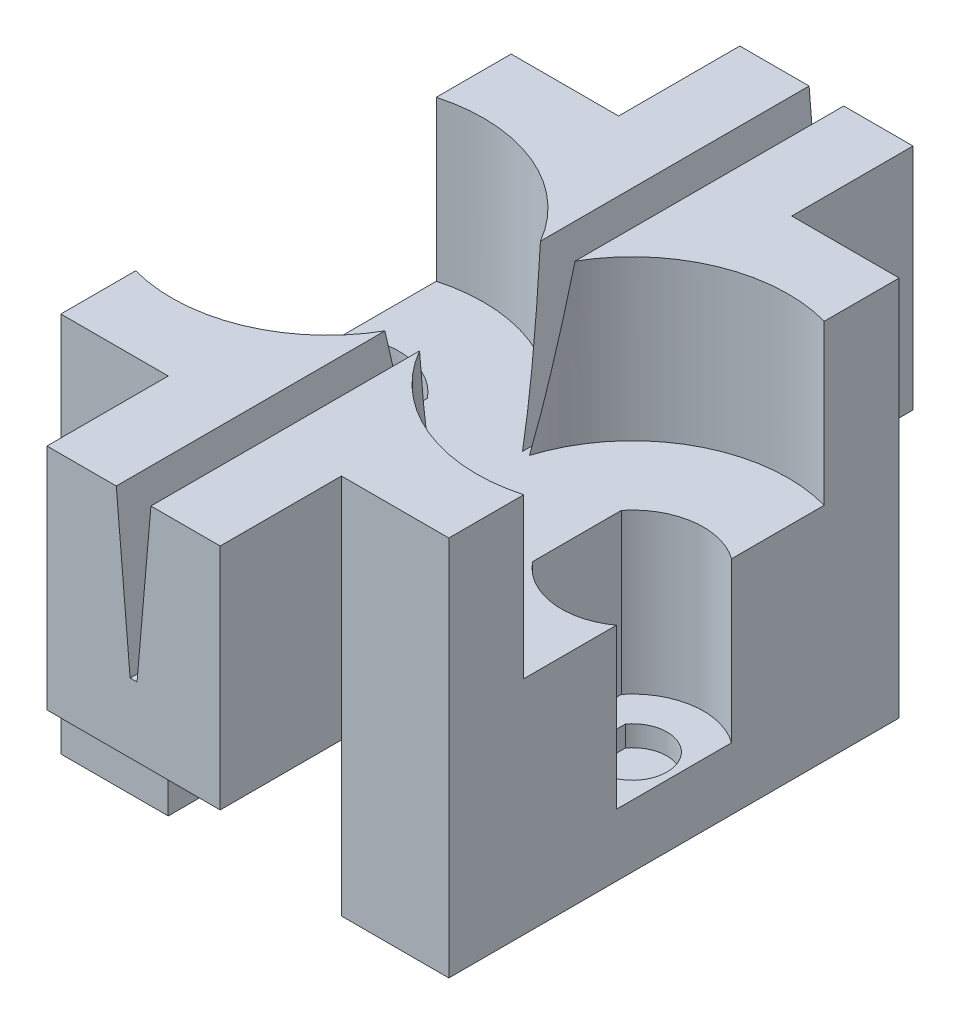
ISO-10303-21;
HEADER;
FILE_DESCRIPTION(('STEP AP214'),'2;1');
FILE_NAME('part.step','',(''),(''),'','','');
FILE_SCHEMA(('AUTOMOTIVE_DESIGN { 1 0 10303 214 1 1 1 1 }'));
ENDSEC;
DATA;
#1=APPLICATION_CONTEXT('core data for automotive mechanical design processes');
#2=APPLICATION_PROTOCOL_DEFINITION('international standard','automotive_design',2000,#1);
#3=PRODUCT_CONTEXT('',#1,'mechanical');
#4=PRODUCT('Part','Part','',(#3));
#5=PRODUCT_RELATED_PRODUCT_CATEGORY('part','',(#4));
#6=PRODUCT_DEFINITION_FORMATION('','',#4);
#7=PRODUCT_DEFINITION_CONTEXT('part definition',#1,'design');
#8=PRODUCT_DEFINITION('design','',#6,#7);
#9=PRODUCT_DEFINITION_SHAPE('','',#8);
#10=(LENGTH_UNIT() NAMED_UNIT(*) SI_UNIT(.MILLI.,.METRE.));
#11=(NAMED_UNIT(*) PLANE_ANGLE_UNIT() SI_UNIT($,.RADIAN.));
#12=(NAMED_UNIT(*) SI_UNIT($,.STERADIAN.) SOLID_ANGLE_UNIT());
#13=UNCERTAINTY_MEASURE_WITH_UNIT(LENGTH_MEASURE(1.E-05),#10,'distance_accuracy_value','');
#14=(GEOMETRIC_REPRESENTATION_CONTEXT(3) GLOBAL_UNCERTAINTY_ASSIGNED_CONTEXT((#13)) GLOBAL_UNIT_ASSIGNED_CONTEXT((#10,
#11,#12)) REPRESENTATION_CONTEXT('',''));
#15=CARTESIAN_POINT('',(0.,0.,0.));
#16=DIRECTION('',(0.,0.,1.));
#17=DIRECTION('',(1.,0.,0.));
#18=AXIS2_PLACEMENT_3D('',#15,#16,#17);
#19=CARTESIAN_POINT('',(0.,0.,0.));
#20=DIRECTION('',(0.,-1.,0.));
#21=DIRECTION('',(0.,0.,-1.));
#22=AXIS2_PLACEMENT_3D('',#19,#20,#21);
#23=PLANE('',#22);
#24=DIRECTION('',(0.,0.,1.));
#25=VECTOR('',#24,1.);
#26=CARTESIAN_POINT('',(-12.5,0.,-50.));
#27=LINE('',#26,#25);
#28=CARTESIAN_POINT('',(-12.5,0.,-32.5));
#29=VERTEX_POINT('',#28);
#30=CARTESIAN_POINT('',(-12.5,0.,32.5));
#31=VERTEX_POINT('',#30);
#32=EDGE_CURVE('E300',#29,#31,#27,.T.);
#33=ORIENTED_EDGE('',*,*,#32,.T.);
#34=DIRECTION('',(-1.,0.,0.));
#35=VECTOR('',#34,1.);
#36=CARTESIAN_POINT('',(-28.,0.,32.5));
#37=LINE('',#36,#35);
#38=CARTESIAN_POINT('',(-28.,0.,32.5));
#39=VERTEX_POINT('',#38);
#40=EDGE_CURVE('E611',#31,#39,#37,.T.);
#41=ORIENTED_EDGE('',*,*,#40,.T.);
#42=DIRECTION('',(0.,0.,1.));
#43=VECTOR('',#42,1.);
#44=CARTESIAN_POINT('',(-28.,0.,50.));
#45=LINE('',#44,#43);
#46=CARTESIAN_POINT('',(-28.,0.,-32.5));
#47=VERTEX_POINT('',#46);
#48=EDGE_CURVE('E467',#47,#39,#45,.T.);
#49=ORIENTED_EDGE('',*,*,#48,.F.);
#50=DIRECTION('',(1.,0.,0.));
#51=VECTOR('',#50,1.);
#52=CARTESIAN_POINT('',(-28.,0.,-32.5));
#53=LINE('',#52,#51);
#54=EDGE_CURVE('E318',#47,#29,#53,.T.);
#55=ORIENTED_EDGE('',*,*,#54,.T.);
#56=EDGE_LOOP('',(#33,#41,#49,#55));
#57=FACE_BOUND('',#56,.T.);
#58=ADVANCED_FACE('F35',(#57),#23,.T.);
#59=CARTESIAN_POINT('',(-14.,9.,-6.40800280898814));
#60=DIRECTION('',(-1.,0.,0.));
#61=DIRECTION('',(0.,0.,1.));
#62=AXIS2_PLACEMENT_3D('',#59,#60,#61);
#63=PLANE('',#62);
#64=DIRECTION('',(0.,0.,-1.));
#65=VECTOR('',#64,1.);
#66=CARTESIAN_POINT('',(-14.,32.,-50.));
#67=LINE('',#66,#65);
#68=CARTESIAN_POINT('',(-14.,32.,6.40800280898814));
#69=VERTEX_POINT('',#68);
#70=CARTESIAN_POINT('',(-14.,32.,-6.40800280898814));
#71=VERTEX_POINT('',#70);
#72=EDGE_CURVE('E340',#69,#71,#67,.T.);
#73=ORIENTED_EDGE('',*,*,#72,.T.);
#74=DIRECTION('',(0.,1.,0.));
#75=VECTOR('',#74,1.);
#76=CARTESIAN_POINT('',(-14.,9.,-6.40800280898814));
#77=LINE('',#76,#75);
#78=CARTESIAN_POINT('',(-14.,9.,-6.40800280898814));
#79=VERTEX_POINT('',#78);
#80=EDGE_CURVE('E337',#79,#71,#77,.T.);
#81=ORIENTED_EDGE('',*,*,#80,.F.);
#82=DIRECTION('',(0.,0.,1.));
#83=VECTOR('',#82,1.);
#84=CARTESIAN_POINT('',(-14.,9.,-6.40800280898814));
#85=LINE('',#84,#83);
#86=CARTESIAN_POINT('',(-14.,9.,6.40800280898814));
#87=VERTEX_POINT('',#86);
#88=EDGE_CURVE('E334',#79,#87,#85,.T.);
#89=ORIENTED_EDGE('',*,*,#88,.T.);
#90=DIRECTION('',(0.,1.,0.));
#91=VECTOR('',#90,1.);
#92=CARTESIAN_POINT('',(-14.,9.,6.40800280898814));
#93=LINE('',#92,#91);
#94=EDGE_CURVE('E336',#87,#69,#93,.T.);
#95=ORIENTED_EDGE('',*,*,#94,.T.);
#96=EDGE_LOOP('',(#73,#81,#89,#95));
#97=FACE_BOUND('',#96,.T.);
#98=ADVANCED_FACE('F584',(#97),#63,.T.);
#99=CARTESIAN_POINT('',(-22.,9.,0.));
#100=DIRECTION('',(0.,-1.,0.));
#101=DIRECTION('',(0.,0.,-1.));
#102=AXIS2_PLACEMENT_3D('',#99,#100,#101);
#103=PLANE('',#102);
#104=CARTESIAN_POINT('',(-22.,9.,0.));
#105=DIRECTION('',(0.,-1.,0.));
#106=DIRECTION('',(0.,0.,-1.));
#107=AXIS2_PLACEMENT_3D('',#104,#105,#106);
#108=CIRCLE('',#107,10.25);
#109=CARTESIAN_POINT('',(-28.,9.,8.3103850692973));
#110=VERTEX_POINT('',#109);
#111=EDGE_CURVE('E331',#87,#110,#108,.T.);
#112=ORIENTED_EDGE('',*,*,#111,.F.);
#113=ORIENTED_EDGE('',*,*,#88,.F.);
#114=CARTESIAN_POINT('',(-28.,9.,-8.31038506929733));
#115=VERTEX_POINT('',#114);
#116=EDGE_CURVE('E329',#115,#79,#108,.T.);
#117=ORIENTED_EDGE('',*,*,#116,.F.);
#118=DIRECTION('',(0.,0.,-1.));
#119=VECTOR('',#118,1.);
#120=CARTESIAN_POINT('',(-28.,9.,50.));
#121=LINE('',#120,#119);
#122=EDGE_CURVE('E11',#110,#115,#121,.T.);
#123=ORIENTED_EDGE('',*,*,#122,.F.);
#124=EDGE_LOOP('',(#112,#113,#117,#123));
#125=FACE_BOUND('',#124,.T.);
#126=CARTESIAN_POINT('',(-22.,9.,0.));
#127=DIRECTION('',(0.,-1.,0.));
#128=DIRECTION('',(0.,0.,-1.));
#129=AXIS2_PLACEMENT_3D('',#126,#127,#128);
#130=CIRCLE('',#129,5.);
#131=CARTESIAN_POINT('',(-18.,9.,3.));
#132=VERTEX_POINT('',#131);
#133=CARTESIAN_POINT('',(-18.,9.,-3.));
#134=VERTEX_POINT('',#133);
#135=EDGE_CURVE('E58',#132,#134,#130,.T.);
#136=ORIENTED_EDGE('',*,*,#135,.T.);
#137=DIRECTION('',(0.,0.,1.));
#138=VECTOR('',#137,1.);
#139=CARTESIAN_POINT('',(-18.,9.,-3.));
#140=LINE('',#139,#138);
#141=EDGE_CURVE('E309',#134,#132,#140,.T.);
#142=ORIENTED_EDGE('',*,*,#141,.T.);
#143=EDGE_LOOP('',(#136,#142));
#144=FACE_BOUND('',#143,.T.);
#145=ADVANCED_FACE('F591',(#125,#144),#103,.F.);
#146=CARTESIAN_POINT('',(-28.,55.,50.));
#147=DIRECTION('',(1.,0.,0.));
#148=DIRECTION('',(0.,0.,-1.));
#149=AXIS2_PLACEMENT_3D('',#146,#147,#148);
#150=PLANE('',#149);
#151=ORIENTED_EDGE('',*,*,#48,.T.);
#152=DIRECTION('',(0.,1.,0.));
#153=VECTOR('',#152,1.);
#154=CARTESIAN_POINT('',(-28.,0.,32.5));
#155=LINE('',#154,#153);
#156=CARTESIAN_POINT('',(-28.,55.,32.5));
#157=VERTEX_POINT('',#156);
#158=EDGE_CURVE('E636',#39,#157,#155,.T.);
#159=ORIENTED_EDGE('',*,*,#158,.T.);
#160=DIRECTION('',(0.,0.,1.));
#161=VECTOR('',#160,1.);
#162=CARTESIAN_POINT('',(-28.,55.,50.));
#163=LINE('',#162,#161);
#164=CARTESIAN_POINT('',(-28.,55.,21.6852484422014));
#165=VERTEX_POINT('',#164);
#166=EDGE_CURVE('E458',#165,#157,#163,.T.);
#167=ORIENTED_EDGE('',*,*,#166,.F.);
#168=DIRECTION('',(0.,1.,0.));
#169=VECTOR('',#168,1.);
#170=CARTESIAN_POINT('',(-28.,32.,21.6852484422014));
#171=LINE('',#170,#169);
#172=CARTESIAN_POINT('',(-28.,32.,21.6852484422014));
#173=VERTEX_POINT('',#172);
#174=EDGE_CURVE('E356',#173,#165,#171,.T.);
#175=ORIENTED_EDGE('',*,*,#174,.F.);
#176=DIRECTION('',(0.,0.,1.));
#177=VECTOR('',#176,1.);
#178=CARTESIAN_POINT('',(-28.,32.,50.));
#179=LINE('',#178,#177);
#180=CARTESIAN_POINT('',(-28.,32.,8.3103850692973));
#181=VERTEX_POINT('',#180);
#182=EDGE_CURVE('E360',#181,#173,#179,.T.);
#183=ORIENTED_EDGE('',*,*,#182,.F.);
#184=DIRECTION('',(0.,1.,0.));
#185=VECTOR('',#184,1.);
#186=CARTESIAN_POINT('',(-28.,9.,8.3103850692973));
#187=LINE('',#186,#185);
#188=EDGE_CURVE('E344',#110,#181,#187,.T.);
#189=ORIENTED_EDGE('',*,*,#188,.F.);
#190=ORIENTED_EDGE('',*,*,#122,.T.);
#191=DIRECTION('',(0.,1.,0.));
#192=VECTOR('',#191,1.);
#193=CARTESIAN_POINT('',(-28.,9.,-8.31038506929733));
#194=LINE('',#193,#192);
#195=CARTESIAN_POINT('',(-28.,32.,-8.31038506929733));
#196=VERTEX_POINT('',#195);
#197=EDGE_CURVE('E346',#196,#115,#194,.F.);
#198=ORIENTED_EDGE('',*,*,#197,.F.);
#199=CARTESIAN_POINT('',(-28.,32.,-21.6852484422015));
#200=VERTEX_POINT('',#199);
#201=EDGE_CURVE('E362',#200,#196,#179,.T.);
#202=ORIENTED_EDGE('',*,*,#201,.F.);
#203=DIRECTION('',(0.,1.,0.));
#204=VECTOR('',#203,1.);
#205=CARTESIAN_POINT('',(-28.,32.,-21.6852484422015));
#206=LINE('',#205,#204);
#207=CARTESIAN_POINT('',(-28.,55.,-21.6852484422015));
#208=VERTEX_POINT('',#207);
#209=EDGE_CURVE('E358',#208,#200,#206,.F.);
#210=ORIENTED_EDGE('',*,*,#209,.F.);
#211=CARTESIAN_POINT('',(-28.,55.,-32.5));
#212=VERTEX_POINT('',#211);
#213=EDGE_CURVE('E459',#212,#208,#163,.T.);
#214=ORIENTED_EDGE('',*,*,#213,.F.);
#215=DIRECTION('',(0.,1.,0.));
#216=VECTOR('',#215,1.);
#217=CARTESIAN_POINT('',(-28.,0.,-32.5));
#218=LINE('',#217,#216);
#219=EDGE_CURVE('E316',#47,#212,#218,.T.);
#220=ORIENTED_EDGE('',*,*,#219,.F.);
#221=EDGE_LOOP('',(#151,#159,#167,#175,#183,#189,#190,#198,#202,#210,#214,#220));
#222=FACE_BOUND('',#221,.T.);
#223=ADVANCED_FACE('F580',(#222),#150,.F.);
#224=CARTESIAN_POINT('',(-0.5,32.,-50.));
#225=DIRECTION('',(0.,-1.,0.));
#226=DIRECTION('',(0.,0.,-1.));
#227=AXIS2_PLACEMENT_3D('',#224,#225,#226);
#228=PLANE('',#227);
#229=ORIENTED_EDGE('',*,*,#72,.F.);
#230=CARTESIAN_POINT('',(-22.,32.,0.));
#231=DIRECTION('',(0.,-1.,0.));
#232=DIRECTION('',(0.,0.,-1.));
#233=AXIS2_PLACEMENT_3D('',#230,#231,#232);
#234=CIRCLE('',#233,10.25);
#235=EDGE_CURVE('E43',#181,#69,#234,.F.);
#236=ORIENTED_EDGE('',*,*,#235,.F.);
#237=ORIENTED_EDGE('',*,*,#182,.T.);
#238=CARTESIAN_POINT('',(-22.,32.,0.));
#239=DIRECTION('',(0.,-1.,0.));
#240=DIRECTION('',(0.,0.,1.));
#241=AXIS2_PLACEMENT_3D('',#238,#239,#240);
#242=CIRCLE('',#241,22.5);
#243=CARTESIAN_POINT('',(-0.500000000000006,32.,6.63324958071084));
#244=VERTEX_POINT('',#243);
#245=EDGE_CURVE('E349',#244,#173,#242,.T.);
#246=ORIENTED_EDGE('',*,*,#245,.F.);
#247=DIRECTION('',(0.,0.,1.));
#248=VECTOR('',#247,1.);
#249=CARTESIAN_POINT('',(-0.5,32.,-50.));
#250=LINE('',#249,#248);
#251=CARTESIAN_POINT('',(-0.5,32.,50.));
#252=VERTEX_POINT('',#251);
#253=EDGE_CURVE('E440',#244,#252,#250,.T.);
#254=ORIENTED_EDGE('',*,*,#253,.T.);
#255=DIRECTION('',(1.,0.,0.));
#256=VECTOR('',#255,1.);
#257=CARTESIAN_POINT('',(-0.5,32.,50.));
#258=LINE('',#257,#256);
#259=CARTESIAN_POINT('',(0.5,32.,50.));
#260=VERTEX_POINT('',#259);
#261=EDGE_CURVE('E417',#252,#260,#258,.T.);
#262=ORIENTED_EDGE('',*,*,#261,.T.);
#263=DIRECTION('',(0.,0.,1.));
#264=VECTOR('',#263,1.);
#265=CARTESIAN_POINT('',(0.5,32.,-50.));
#266=LINE('',#265,#264);
#267=CARTESIAN_POINT('',(0.500000000000007,32.,6.63324958071084));
#268=VERTEX_POINT('',#267);
#269=EDGE_CURVE('E428',#268,#260,#266,.T.);
#270=ORIENTED_EDGE('',*,*,#269,.F.);
#271=CARTESIAN_POINT('',(22.,32.,0.));
#272=DIRECTION('',(0.,1.,0.));
#273=DIRECTION('',(0.,0.,1.));
#274=AXIS2_PLACEMENT_3D('',#271,#272,#273);
#275=CIRCLE('',#274,22.5);
#276=CARTESIAN_POINT('',(28.,32.,21.6852484422014));
#277=VERTEX_POINT('',#276);
#278=EDGE_CURVE('E401',#268,#277,#275,.T.);
#279=ORIENTED_EDGE('',*,*,#278,.T.);
#280=DIRECTION('',(0.,0.,-1.));
#281=VECTOR('',#280,1.);
#282=CARTESIAN_POINT('',(28.,32.,50.));
#283=LINE('',#282,#281);
#284=CARTESIAN_POINT('',(28.,32.,8.3103850692973));
#285=VERTEX_POINT('',#284);
#286=EDGE_CURVE('E410',#277,#285,#283,.T.);
#287=ORIENTED_EDGE('',*,*,#286,.T.);
#288=CARTESIAN_POINT('',(22.,32.,0.));
#289=DIRECTION('',(0.,-1.,0.));
#290=DIRECTION('',(0.,0.,-1.));
#291=AXIS2_PLACEMENT_3D('',#288,#289,#290);
#292=CIRCLE('',#291,10.25);
#293=CARTESIAN_POINT('',(14.,32.,6.40800280898814));
#294=VERTEX_POINT('',#293);
#295=EDGE_CURVE('E476',#285,#294,#292,.T.);
#296=ORIENTED_EDGE('',*,*,#295,.T.);
#297=DIRECTION('',(0.,0.,-1.));
#298=VECTOR('',#297,1.);
#299=CARTESIAN_POINT('',(14.,32.,-50.));
#300=LINE('',#299,#298);
#301=CARTESIAN_POINT('',(14.,32.,-6.40800280898814));
#302=VERTEX_POINT('',#301);
#303=EDGE_CURVE('E390',#294,#302,#300,.T.);
#304=ORIENTED_EDGE('',*,*,#303,.T.);
#305=CARTESIAN_POINT('',(28.,32.,-8.31038506929733));
#306=VERTEX_POINT('',#305);
#307=EDGE_CURVE('E473',#302,#306,#292,.T.);
#308=ORIENTED_EDGE('',*,*,#307,.T.);
#309=CARTESIAN_POINT('',(28.,32.,-21.6852484422015));
#310=VERTEX_POINT('',#309);
#311=EDGE_CURVE('E408',#306,#310,#283,.T.);
#312=ORIENTED_EDGE('',*,*,#311,.T.);
#313=CARTESIAN_POINT('',(0.5,32.,-6.63324958071086));
#314=VERTEX_POINT('',#313);
#315=EDGE_CURVE('E404',#310,#314,#275,.T.);
#316=ORIENTED_EDGE('',*,*,#315,.T.);
#317=CARTESIAN_POINT('',(0.5,32.,-50.));
#318=VERTEX_POINT('',#317);
#319=EDGE_CURVE('E449',#318,#314,#266,.T.);
#320=ORIENTED_EDGE('',*,*,#319,.F.);
#321=DIRECTION('',(1.,0.,0.));
#322=VECTOR('',#321,1.);
#323=CARTESIAN_POINT('',(-0.5,32.,-50.));
#324=LINE('',#323,#322);
#325=CARTESIAN_POINT('',(-0.5,32.,-50.));
#326=VERTEX_POINT('',#325);
#327=EDGE_CURVE('E418',#326,#318,#324,.T.);
#328=ORIENTED_EDGE('',*,*,#327,.F.);
#329=CARTESIAN_POINT('',(-0.5,32.,-6.63324958071086));
#330=VERTEX_POINT('',#329);
#331=EDGE_CURVE('E436',#326,#330,#250,.T.);
#332=ORIENTED_EDGE('',*,*,#331,.T.);
#333=EDGE_CURVE('E352',#200,#330,#242,.T.);
#334=ORIENTED_EDGE('',*,*,#333,.F.);
#335=ORIENTED_EDGE('',*,*,#201,.T.);
#336=EDGE_CURVE('E482',#71,#196,#234,.F.);
#337=ORIENTED_EDGE('',*,*,#336,.F.);
#338=EDGE_LOOP('',(#229,#236,#237,#246,#254,#262,#270,#279,#287,#296,#304,#308,#312,#316,#320,
#328,#332,#334,#335,#337));
#339=FACE_BOUND('',#338,.T.);
#340=ADVANCED_FACE('F497',(#339),#228,.F.);
#341=CARTESIAN_POINT('',(0.,55.,0.));
#342=DIRECTION('',(0.,-1.,0.));
#343=DIRECTION('',(0.,0.,-1.));
#344=AXIS2_PLACEMENT_3D('',#341,#342,#343);
#345=PLANE('',#344);
#346=ORIENTED_EDGE('',*,*,#166,.T.);
#347=DIRECTION('',(-1.,0.,0.));
#348=VECTOR('',#347,1.);
#349=CARTESIAN_POINT('',(-28.,55.,32.5));
#350=LINE('',#349,#348);
#351=CARTESIAN_POINT('',(-12.5,55.,32.5));
#352=VERTEX_POINT('',#351);
#353=EDGE_CURVE('E616',#352,#157,#350,.T.);
#354=ORIENTED_EDGE('',*,*,#353,.F.);
#355=DIRECTION('',(0.,0.,-1.));
#356=VECTOR('',#355,1.);
#357=CARTESIAN_POINT('',(-12.5,55.,50.));
#358=LINE('',#357,#356);
#359=CARTESIAN_POINT('',(-12.5,55.,50.));
#360=VERTEX_POINT('',#359);
#361=EDGE_CURVE('E604',#360,#352,#358,.T.);
#362=ORIENTED_EDGE('',*,*,#361,.F.);
#363=DIRECTION('',(1.,0.,0.));
#364=VECTOR('',#363,1.);
#365=CARTESIAN_POINT('',(-28.,55.,50.));
#366=LINE('',#365,#364);
#367=CARTESIAN_POINT('',(-2.5,55.,50.));
#368=VERTEX_POINT('',#367);
#369=EDGE_CURVE('E462',#360,#368,#366,.T.);
#370=ORIENTED_EDGE('',*,*,#369,.T.);
#371=DIRECTION('',(0.,0.,1.));
#372=VECTOR('',#371,1.);
#373=CARTESIAN_POINT('',(-2.5,55.,-50.));
#374=LINE('',#373,#372);
#375=CARTESIAN_POINT('',(-2.50000000000001,55.,11.2249721603218));
#376=VERTEX_POINT('',#375);
#377=EDGE_CURVE('E444',#376,#368,#374,.T.);
#378=ORIENTED_EDGE('',*,*,#377,.F.);
#379=CARTESIAN_POINT('',(-22.,55.,0.));
#380=DIRECTION('',(0.,-1.,0.));
#381=DIRECTION('',(0.,0.,1.));
#382=AXIS2_PLACEMENT_3D('',#379,#380,#381);
#383=CIRCLE('',#382,22.5);
#384=EDGE_CURVE('E348',#376,#165,#383,.T.);
#385=ORIENTED_EDGE('',*,*,#384,.T.);
#386=EDGE_LOOP('',(#346,#354,#362,#370,#378,#385));
#387=FACE_BOUND('',#386,.T.);
#388=ADVANCED_FACE('F600',(#387),#345,.F.);
#389=CARTESIAN_POINT('',(-0.5,32.,-50.));
#390=DIRECTION('',(-0.996240588195683,-0.0866296163648421,0.));
#391=DIRECTION('',(0.0866296163648421,-0.996240588195683,0.));
#392=AXIS2_PLACEMENT_3D('',#389,#390,#391);
#393=PLANE('',#392);
#394=CARTESIAN_POINT('',(-22.,279.25,0.));
#395=DIRECTION('',(-0.996240588195683,-0.0866296163648421,0.));
#396=DIRECTION('',(-0.0866296163648421,0.996240588195683,0.));
#397=AXIS2_PLACEMENT_3D('',#394,#395,#396);
#398=ELLIPSE('',#397,259.726418563842,22.5);
#399=EDGE_CURVE('E481',#376,#244,#398,.F.);
#400=ORIENTED_EDGE('',*,*,#399,.F.);
#401=ORIENTED_EDGE('',*,*,#377,.T.);
#402=DIRECTION('',(0.0866296163648421,-0.996240588195683,0.));
#403=VECTOR('',#402,1.);
#404=CARTESIAN_POINT('',(-0.5,32.,50.));
#405=LINE('',#404,#403);
#406=EDGE_CURVE('E422',#368,#252,#405,.T.);
#407=ORIENTED_EDGE('',*,*,#406,.T.);
#408=ORIENTED_EDGE('',*,*,#253,.F.);
#409=EDGE_LOOP('',(#400,#401,#407,#408));
#410=FACE_BOUND('',#409,.T.);
#411=ADVANCED_FACE('F500',(#410),#393,.F.);
#412=CARTESIAN_POINT('',(14.,9.,-6.40800280898814));
#413=DIRECTION('',(-1.,0.,0.));
#414=DIRECTION('',(0.,0.,1.));
#415=AXIS2_PLACEMENT_3D('',#412,#413,#414);
#416=PLANE('',#415);
#417=DIRECTION('',(0.,1.,0.));
#418=VECTOR('',#417,1.);
#419=CARTESIAN_POINT('',(14.,9.,-6.40800280898814));
#420=LINE('',#419,#418);
#421=CARTESIAN_POINT('',(14.,9.,-6.40800280898814));
#422=VERTEX_POINT('',#421);
#423=EDGE_CURVE('E386',#422,#302,#420,.T.);
#424=ORIENTED_EDGE('',*,*,#423,.T.);
#425=ORIENTED_EDGE('',*,*,#303,.F.);
#426=DIRECTION('',(0.,1.,0.));
#427=VECTOR('',#426,1.);
#428=CARTESIAN_POINT('',(14.,9.,6.40800280898814));
#429=LINE('',#428,#427);
#430=CARTESIAN_POINT('',(14.,9.,6.40800280898814));
#431=VERTEX_POINT('',#430);
#432=EDGE_CURVE('E387',#431,#294,#429,.T.);
#433=ORIENTED_EDGE('',*,*,#432,.F.);
#434=DIRECTION('',(0.,0.,1.));
#435=VECTOR('',#434,1.);
#436=CARTESIAN_POINT('',(14.,9.,-6.40800280898814));
#437=LINE('',#436,#435);
#438=EDGE_CURVE('E383',#422,#431,#437,.T.);
#439=ORIENTED_EDGE('',*,*,#438,.F.);
#440=EDGE_LOOP('',(#424,#425,#433,#439));
#441=FACE_BOUND('',#440,.T.);
#442=ADVANCED_FACE('F537',(#441),#416,.F.);
#443=CARTESIAN_POINT('',(2.5,55.,50.));
#444=VERTEX_POINT('',#443);
#445=CARTESIAN_POINT('',(12.5,55.,50.));
#446=VERTEX_POINT('',#445);
#447=EDGE_CURVE('E461',#444,#446,#366,.T.);
#448=ORIENTED_EDGE('',*,*,#447,.T.);
#449=DIRECTION('',(0.,0.,1.));
#450=VECTOR('',#449,1.);
#451=CARTESIAN_POINT('',(12.5,55.,50.));
#452=LINE('',#451,#450);
#453=CARTESIAN_POINT('',(12.5,55.,32.5));
#454=VERTEX_POINT('',#453);
#455=EDGE_CURVE('E658',#454,#446,#452,.T.);
#456=ORIENTED_EDGE('',*,*,#455,.F.);
#457=DIRECTION('',(-1.,0.,0.));
#458=VECTOR('',#457,1.);
#459=CARTESIAN_POINT('',(28.,55.,32.5));
#460=LINE('',#459,#458);
#461=CARTESIAN_POINT('',(28.,55.,32.5));
#462=VERTEX_POINT('',#461);
#463=EDGE_CURVE('E289',#462,#454,#460,.T.);
#464=ORIENTED_EDGE('',*,*,#463,.F.);
#465=DIRECTION('',(0.,0.,-1.));
#466=VECTOR('',#465,1.);
#467=CARTESIAN_POINT('',(28.,55.,50.));
#468=LINE('',#467,#466);
#469=CARTESIAN_POINT('',(28.,55.,21.6852484422014));
#470=VERTEX_POINT('',#469);
#471=EDGE_CURVE('E452',#462,#470,#468,.T.);
#472=ORIENTED_EDGE('',*,*,#471,.T.);
#473=CARTESIAN_POINT('',(22.,55.,0.));
#474=DIRECTION('',(0.,1.,0.));
#475=DIRECTION('',(0.,0.,1.));
#476=AXIS2_PLACEMENT_3D('',#473,#474,#475);
#477=CIRCLE('',#476,22.5);
#478=CARTESIAN_POINT('',(2.50000000000001,55.,11.2249721603218));
#479=VERTEX_POINT('',#478);
#480=EDGE_CURVE('E400',#479,#470,#477,.T.);
#481=ORIENTED_EDGE('',*,*,#480,.F.);
#482=DIRECTION('',(0.,0.,1.));
#483=VECTOR('',#482,1.);
#484=CARTESIAN_POINT('',(2.5,55.,-50.));
#485=LINE('',#484,#483);
#486=EDGE_CURVE('E448',#479,#444,#485,.T.);
#487=ORIENTED_EDGE('',*,*,#486,.T.);
#488=EDGE_LOOP('',(#448,#456,#464,#472,#481,#487));
#489=FACE_BOUND('',#488,.T.);
#490=ADVANCED_FACE('F521',(#489),#345,.F.);
#491=CARTESIAN_POINT('',(2.5,55.,-50.));
#492=DIRECTION('',(0.996240588195683,-0.0866296163648419,0.));
#493=DIRECTION('',(0.0866296163648419,0.996240588195683,0.));
#494=AXIS2_PLACEMENT_3D('',#491,#492,#493);
#495=PLANE('',#494);
#496=ORIENTED_EDGE('',*,*,#486,.F.);
#497=CARTESIAN_POINT('',(22.,279.25,0.));
#498=DIRECTION('',(0.996240588195683,-0.0866296163648419,0.));
#499=DIRECTION('',(0.0866296163648419,0.996240588195683,0.));
#500=AXIS2_PLACEMENT_3D('',#497,#498,#499);
#501=ELLIPSE('',#500,259.726418563842,22.5);
#502=EDGE_CURVE('E472',#479,#268,#501,.T.);
#503=ORIENTED_EDGE('',*,*,#502,.T.);
#504=ORIENTED_EDGE('',*,*,#269,.T.);
#505=DIRECTION('',(0.0866296163648419,0.996240588195683,0.));
#506=VECTOR('',#505,1.);
#507=CARTESIAN_POINT('',(2.5,55.,50.));
#508=LINE('',#507,#506);
#509=EDGE_CURVE('E431',#260,#444,#508,.T.);
#510=ORIENTED_EDGE('',*,*,#509,.T.);
#511=EDGE_LOOP('',(#496,#503,#504,#510));
#512=FACE_BOUND('',#511,.T.);
#513=ADVANCED_FACE('F515',(#512),#495,.F.);
#514=DIRECTION('',(-1.,0.,0.));
#515=VECTOR('',#514,1.);
#516=CARTESIAN_POINT('',(-28.,55.,-50.));
#517=LINE('',#516,#515);
#518=CARTESIAN_POINT('',(-2.5,55.,-50.));
#519=VERTEX_POINT('',#518);
#520=CARTESIAN_POINT('',(-12.5,55.,-50.));
#521=VERTEX_POINT('',#520);
#522=EDGE_CURVE('E454',#519,#521,#517,.T.);
#523=ORIENTED_EDGE('',*,*,#522,.T.);
#524=DIRECTION('',(0.,0.,-1.));
#525=VECTOR('',#524,1.);
#526=CARTESIAN_POINT('',(-12.5,55.,-50.));
#527=LINE('',#526,#525);
#528=CARTESIAN_POINT('',(-12.5,55.,-32.5));
#529=VERTEX_POINT('',#528);
#530=EDGE_CURVE('E305',#529,#521,#527,.T.);
#531=ORIENTED_EDGE('',*,*,#530,.F.);
#532=DIRECTION('',(1.,0.,0.));
#533=VECTOR('',#532,1.);
#534=CARTESIAN_POINT('',(-28.,55.,-32.5));
#535=LINE('',#534,#533);
#536=EDGE_CURVE('E577',#212,#529,#535,.T.);
#537=ORIENTED_EDGE('',*,*,#536,.F.);
#538=ORIENTED_EDGE('',*,*,#213,.T.);
#539=CARTESIAN_POINT('',(-2.50000000000001,55.,-11.2249721603219));
#540=VERTEX_POINT('',#539);
#541=EDGE_CURVE('E353',#208,#540,#383,.T.);
#542=ORIENTED_EDGE('',*,*,#541,.T.);
#543=EDGE_CURVE('E441',#519,#540,#374,.T.);
#544=ORIENTED_EDGE('',*,*,#543,.F.);
#545=EDGE_LOOP('',(#523,#531,#537,#538,#542,#544));
#546=FACE_BOUND('',#545,.T.);
#547=ADVANCED_FACE('F573',(#546),#345,.F.);
#548=CARTESIAN_POINT('',(28.,55.,50.));
#549=DIRECTION('',(-1.,0.,0.));
#550=DIRECTION('',(0.,0.,1.));
#551=AXIS2_PLACEMENT_3D('',#548,#549,#550);
#552=PLANE('',#551);
#553=DIRECTION('',(0.,0.,-1.));
#554=VECTOR('',#553,1.);
#555=CARTESIAN_POINT('',(28.,0.,50.));
#556=LINE('',#555,#554);
#557=CARTESIAN_POINT('',(28.,0.,32.5));
#558=VERTEX_POINT('',#557);
#559=CARTESIAN_POINT('',(28.,0.,-32.5));
#560=VERTEX_POINT('',#559);
#561=EDGE_CURVE('E439',#558,#560,#556,.T.);
#562=ORIENTED_EDGE('',*,*,#561,.T.);
#563=DIRECTION('',(0.,1.,0.));
#564=VECTOR('',#563,1.);
#565=CARTESIAN_POINT('',(28.,0.,-32.5));
#566=LINE('',#565,#564);
#567=CARTESIAN_POINT('',(28.,55.,-32.5));
#568=VERTEX_POINT('',#567);
#569=EDGE_CURVE('E621',#560,#568,#566,.T.);
#570=ORIENTED_EDGE('',*,*,#569,.T.);
#571=CARTESIAN_POINT('',(28.,55.,-21.6852484422015));
#572=VERTEX_POINT('',#571);
#573=EDGE_CURVE('E455',#572,#568,#468,.T.);
#574=ORIENTED_EDGE('',*,*,#573,.F.);
#575=DIRECTION('',(0.,1.,0.));
#576=VECTOR('',#575,1.);
#577=CARTESIAN_POINT('',(28.,32.,-21.6852484422015));
#578=LINE('',#577,#576);
#579=EDGE_CURVE('E411',#572,#310,#578,.F.);
#580=ORIENTED_EDGE('',*,*,#579,.T.);
#581=ORIENTED_EDGE('',*,*,#311,.F.);
#582=DIRECTION('',(0.,1.,0.));
#583=VECTOR('',#582,1.);
#584=CARTESIAN_POINT('',(28.,9.,-8.31038506929733));
#585=LINE('',#584,#583);
#586=CARTESIAN_POINT('',(28.,9.,-8.31038506929733));
#587=VERTEX_POINT('',#586);
#588=EDGE_CURVE('E397',#306,#587,#585,.F.);
#589=ORIENTED_EDGE('',*,*,#588,.T.);
#590=DIRECTION('',(0.,0.,1.));
#591=VECTOR('',#590,1.);
#592=CARTESIAN_POINT('',(28.,9.,50.));
#593=LINE('',#592,#591);
#594=CARTESIAN_POINT('',(28.,9.,8.3103850692973));
#595=VERTEX_POINT('',#594);
#596=EDGE_CURVE('E477',#587,#595,#593,.T.);
#597=ORIENTED_EDGE('',*,*,#596,.T.);
#598=DIRECTION('',(0.,1.,0.));
#599=VECTOR('',#598,1.);
#600=CARTESIAN_POINT('',(28.,9.,8.3103850692973));
#601=LINE('',#600,#599);
#602=EDGE_CURVE('E394',#595,#285,#601,.T.);
#603=ORIENTED_EDGE('',*,*,#602,.T.);
#604=ORIENTED_EDGE('',*,*,#286,.F.);
#605=DIRECTION('',(0.,1.,0.));
#606=VECTOR('',#605,1.);
#607=CARTESIAN_POINT('',(28.,32.,21.6852484422014));
#608=LINE('',#607,#606);
#609=EDGE_CURVE('E414',#277,#470,#608,.T.);
#610=ORIENTED_EDGE('',*,*,#609,.T.);
#611=ORIENTED_EDGE('',*,*,#471,.F.);
#612=DIRECTION('',(0.,1.,0.));
#613=VECTOR('',#612,1.);
#614=CARTESIAN_POINT('',(28.,0.,32.5));
#615=LINE('',#614,#613);
#616=EDGE_CURVE('E528',#558,#462,#615,.T.);
#617=ORIENTED_EDGE('',*,*,#616,.F.);
#618=EDGE_LOOP('',(#562,#570,#574,#580,#581,#589,#597,#603,#604,#610,#611,#617));
#619=FACE_BOUND('',#618,.T.);
#620=ADVANCED_FACE('F37',(#619),#552,.F.);
#621=CARTESIAN_POINT('',(-28.,55.,-50.));
#622=DIRECTION('',(0.,0.,1.));
#623=DIRECTION('',(1.,0.,0.));
#624=AXIS2_PLACEMENT_3D('',#621,#622,#623);
#625=PLANE('',#624);
#626=DIRECTION('',(0.,1.,0.));
#627=VECTOR('',#626,1.);
#628=CARTESIAN_POINT('',(12.5,0.,-50.));
#629=LINE('',#628,#627);
#630=CARTESIAN_POINT('',(12.5,22.,-50.));
#631=VERTEX_POINT('',#630);
#632=CARTESIAN_POINT('',(12.5,55.,-50.));
#633=VERTEX_POINT('',#632);
#634=EDGE_CURVE('E299',#631,#633,#629,.T.);
#635=ORIENTED_EDGE('',*,*,#634,.F.);
#636=DIRECTION('',(-1.,0.,0.));
#637=VECTOR('',#636,1.);
#638=CARTESIAN_POINT('',(-12.5,22.,-50.));
#639=LINE('',#638,#637);
#640=CARTESIAN_POINT('',(-12.5,22.,-50.));
#641=VERTEX_POINT('',#640);
#642=EDGE_CURVE('E50',#631,#641,#639,.T.);
#643=ORIENTED_EDGE('',*,*,#642,.T.);
#644=DIRECTION('',(0.,1.,0.));
#645=VECTOR('',#644,1.);
#646=CARTESIAN_POINT('',(-12.5,0.,-50.));
#647=LINE('',#646,#645);
#648=EDGE_CURVE('E296',#641,#521,#647,.T.);
#649=ORIENTED_EDGE('',*,*,#648,.T.);
#650=ORIENTED_EDGE('',*,*,#522,.F.);
#651=DIRECTION('',(0.0866296163648421,-0.996240588195683,0.));
#652=VECTOR('',#651,1.);
#653=CARTESIAN_POINT('',(-0.5,32.,-50.));
#654=LINE('',#653,#652);
#655=EDGE_CURVE('E425',#519,#326,#654,.T.);
#656=ORIENTED_EDGE('',*,*,#655,.T.);
#657=ORIENTED_EDGE('',*,*,#327,.T.);
#658=DIRECTION('',(0.0866296163648419,0.996240588195683,0.));
#659=VECTOR('',#658,1.);
#660=CARTESIAN_POINT('',(2.5,55.,-50.));
#661=LINE('',#660,#659);
#662=CARTESIAN_POINT('',(2.5,55.,-50.));
#663=VERTEX_POINT('',#662);
#664=EDGE_CURVE('E421',#318,#663,#661,.T.);
#665=ORIENTED_EDGE('',*,*,#664,.T.);
#666=EDGE_CURVE('E456',#633,#663,#517,.T.);
#667=ORIENTED_EDGE('',*,*,#666,.F.);
#668=EDGE_LOOP('',(#635,#643,#649,#650,#656,#657,#665,#667));
#669=FACE_BOUND('',#668,.T.);
#670=ADVANCED_FACE('F294',(#669),#625,.F.);
#671=CARTESIAN_POINT('',(-28.,55.,50.));
#672=DIRECTION('',(0.,0.,-1.));
#673=DIRECTION('',(-1.,0.,0.));
#674=AXIS2_PLACEMENT_3D('',#671,#672,#673);
#675=PLANE('',#674);
#676=DIRECTION('',(0.,1.,0.));
#677=VECTOR('',#676,1.);
#678=CARTESIAN_POINT('',(-12.5,0.,50.));
#679=LINE('',#678,#677);
#680=CARTESIAN_POINT('',(-12.5,22.,50.));
#681=VERTEX_POINT('',#680);
#682=EDGE_CURVE('E606',#681,#360,#679,.T.);
#683=ORIENTED_EDGE('',*,*,#682,.F.);
#684=DIRECTION('',(-1.,0.,0.));
#685=VECTOR('',#684,1.);
#686=CARTESIAN_POINT('',(-12.5,22.,50.));
#687=LINE('',#686,#685);
#688=CARTESIAN_POINT('',(12.5,22.,50.));
#689=VERTEX_POINT('',#688);
#690=EDGE_CURVE('E301',#689,#681,#687,.T.);
#691=ORIENTED_EDGE('',*,*,#690,.F.);
#692=DIRECTION('',(0.,1.,0.));
#693=VECTOR('',#692,1.);
#694=CARTESIAN_POINT('',(12.5,0.,50.));
#695=LINE('',#694,#693);
#696=EDGE_CURVE('E635',#689,#446,#695,.T.);
#697=ORIENTED_EDGE('',*,*,#696,.T.);
#698=ORIENTED_EDGE('',*,*,#447,.F.);
#699=ORIENTED_EDGE('',*,*,#509,.F.);
#700=ORIENTED_EDGE('',*,*,#261,.F.);
#701=ORIENTED_EDGE('',*,*,#406,.F.);
#702=ORIENTED_EDGE('',*,*,#369,.F.);
#703=EDGE_LOOP('',(#683,#691,#697,#698,#699,#700,#701,#702));
#704=FACE_BOUND('',#703,.T.);
#705=ADVANCED_FACE('F507',(#704),#675,.F.);
#706=ORIENTED_EDGE('',*,*,#573,.T.);
#707=DIRECTION('',(1.,0.,0.));
#708=VECTOR('',#707,1.);
#709=CARTESIAN_POINT('',(28.,55.,-32.5));
#710=LINE('',#709,#708);
#711=CARTESIAN_POINT('',(12.5,55.,-32.5));
#712=VERTEX_POINT('',#711);
#713=EDGE_CURVE('E629',#712,#568,#710,.T.);
#714=ORIENTED_EDGE('',*,*,#713,.F.);
#715=DIRECTION('',(0.,0.,1.));
#716=VECTOR('',#715,1.);
#717=CARTESIAN_POINT('',(12.5,55.,-50.));
#718=LINE('',#717,#716);
#719=EDGE_CURVE('E637',#633,#712,#718,.T.);
#720=ORIENTED_EDGE('',*,*,#719,.F.);
#721=ORIENTED_EDGE('',*,*,#666,.T.);
#722=CARTESIAN_POINT('',(2.50000000000001,55.,-11.2249721603219));
#723=VERTEX_POINT('',#722);
#724=EDGE_CURVE('E445',#663,#723,#485,.T.);
#725=ORIENTED_EDGE('',*,*,#724,.T.);
#726=EDGE_CURVE('E405',#572,#723,#477,.T.);
#727=ORIENTED_EDGE('',*,*,#726,.F.);
#728=EDGE_LOOP('',(#706,#714,#720,#721,#725,#727));
#729=FACE_BOUND('',#728,.T.);
#730=ADVANCED_FACE('F552',(#729),#345,.F.);
#731=DIRECTION('',(0.,0.,1.));
#732=VECTOR('',#731,1.);
#733=CARTESIAN_POINT('',(12.5,0.,-50.));
#734=LINE('',#733,#732);
#735=CARTESIAN_POINT('',(12.5,0.,-32.5));
#736=VERTEX_POINT('',#735);
#737=CARTESIAN_POINT('',(12.5,0.,32.5));
#738=VERTEX_POINT('',#737);
#739=EDGE_CURVE('E649',#736,#738,#734,.T.);
#740=ORIENTED_EDGE('',*,*,#739,.F.);
#741=DIRECTION('',(1.,0.,0.));
#742=VECTOR('',#741,1.);
#743=CARTESIAN_POINT('',(28.,0.,-32.5));
#744=LINE('',#743,#742);
#745=EDGE_CURVE('E632',#736,#560,#744,.T.);
#746=ORIENTED_EDGE('',*,*,#745,.T.);
#747=ORIENTED_EDGE('',*,*,#561,.F.);
#748=DIRECTION('',(-1.,0.,0.));
#749=VECTOR('',#748,1.);
#750=CARTESIAN_POINT('',(28.,0.,32.5));
#751=LINE('',#750,#749);
#752=EDGE_CURVE('E655',#558,#738,#751,.T.);
#753=ORIENTED_EDGE('',*,*,#752,.T.);
#754=EDGE_LOOP('',(#740,#746,#747,#753));
#755=FACE_BOUND('',#754,.T.);
#756=ADVANCED_FACE('F686',(#755),#23,.T.);
#757=EDGE_CURVE('E480',#330,#540,#398,.F.);
#758=ORIENTED_EDGE('',*,*,#757,.F.);
#759=ORIENTED_EDGE('',*,*,#331,.F.);
#760=ORIENTED_EDGE('',*,*,#655,.F.);
#761=ORIENTED_EDGE('',*,*,#543,.T.);
#762=EDGE_LOOP('',(#758,#759,#760,#761));
#763=FACE_BOUND('',#762,.T.);
#764=ADVANCED_FACE('F565',(#763),#393,.F.);
#765=ORIENTED_EDGE('',*,*,#319,.T.);
#766=EDGE_CURVE('E464',#314,#723,#501,.T.);
#767=ORIENTED_EDGE('',*,*,#766,.T.);
#768=ORIENTED_EDGE('',*,*,#724,.F.);
#769=ORIENTED_EDGE('',*,*,#664,.F.);
#770=EDGE_LOOP('',(#765,#767,#768,#769));
#771=FACE_BOUND('',#770,.T.);
#772=ADVANCED_FACE('F558',(#771),#495,.F.);
#773=CARTESIAN_POINT('',(22.,32.,0.));
#774=DIRECTION('',(0.,1.,0.));
#775=DIRECTION('',(0.,0.,1.));
#776=AXIS2_PLACEMENT_3D('',#773,#774,#775);
#777=CYLINDRICAL_SURFACE('',#776,22.5);
#778=ORIENTED_EDGE('',*,*,#278,.F.);
#779=ORIENTED_EDGE('',*,*,#502,.F.);
#780=ORIENTED_EDGE('',*,*,#480,.T.);
#781=ORIENTED_EDGE('',*,*,#609,.F.);
#782=EDGE_LOOP('',(#778,#779,#780,#781));
#783=FACE_BOUND('',#782,.T.);
#784=ADVANCED_FACE('F518',(#783),#777,.F.);
#785=ORIENTED_EDGE('',*,*,#726,.T.);
#786=ORIENTED_EDGE('',*,*,#766,.F.);
#787=ORIENTED_EDGE('',*,*,#315,.F.);
#788=ORIENTED_EDGE('',*,*,#579,.F.);
#789=EDGE_LOOP('',(#785,#786,#787,#788));
#790=FACE_BOUND('',#789,.T.);
#791=ADVANCED_FACE('F549',(#790),#777,.F.);
#792=CARTESIAN_POINT('',(22.,9.,0.));
#793=DIRECTION('',(0.,-1.,0.));
#794=DIRECTION('',(0.,0.,-1.));
#795=AXIS2_PLACEMENT_3D('',#792,#793,#794);
#796=PLANE('',#795);
#797=DIRECTION('',(0.,0.,1.));
#798=VECTOR('',#797,1.);
#799=CARTESIAN_POINT('',(18.,9.,-3.));
#800=LINE('',#799,#798);
#801=CARTESIAN_POINT('',(18.,9.,-3.));
#802=VERTEX_POINT('',#801);
#803=CARTESIAN_POINT('',(18.,9.,3.));
#804=VERTEX_POINT('',#803);
#805=EDGE_CURVE('E367',#802,#804,#800,.T.);
#806=ORIENTED_EDGE('',*,*,#805,.F.);
#807=CARTESIAN_POINT('',(22.,9.,0.));
#808=DIRECTION('',(0.,1.,0.));
#809=DIRECTION('',(0.,0.,-1.));
#810=AXIS2_PLACEMENT_3D('',#807,#808,#809);
#811=CIRCLE('',#810,5.);
#812=EDGE_CURVE('E371',#804,#802,#811,.T.);
#813=ORIENTED_EDGE('',*,*,#812,.F.);
#814=EDGE_LOOP('',(#806,#813));
#815=FACE_BOUND('',#814,.T.);
#816=CARTESIAN_POINT('',(22.,9.,0.));
#817=DIRECTION('',(0.,1.,0.));
#818=DIRECTION('',(0.,0.,-1.));
#819=AXIS2_PLACEMENT_3D('',#816,#817,#818);
#820=CIRCLE('',#819,10.25);
#821=EDGE_CURVE('E377',#587,#422,#820,.T.);
#822=ORIENTED_EDGE('',*,*,#821,.T.);
#823=ORIENTED_EDGE('',*,*,#438,.T.);
#824=EDGE_CURVE('E380',#431,#595,#820,.T.);
#825=ORIENTED_EDGE('',*,*,#824,.T.);
#826=ORIENTED_EDGE('',*,*,#596,.F.);
#827=EDGE_LOOP('',(#822,#823,#825,#826));
#828=FACE_BOUND('',#827,.T.);
#829=ADVANCED_FACE('F732',(#815,#828),#796,.F.);
#830=CARTESIAN_POINT('',(22.,9.,0.));
#831=DIRECTION('',(0.,1.,0.));
#832=DIRECTION('',(0.,0.,1.));
#833=AXIS2_PLACEMENT_3D('',#830,#831,#832);
#834=CYLINDRICAL_SURFACE('',#833,10.25);
#835=ORIENTED_EDGE('',*,*,#307,.F.);
#836=ORIENTED_EDGE('',*,*,#423,.F.);
#837=ORIENTED_EDGE('',*,*,#821,.F.);
#838=ORIENTED_EDGE('',*,*,#588,.F.);
#839=EDGE_LOOP('',(#835,#836,#837,#838));
#840=FACE_BOUND('',#839,.T.);
#841=ADVANCED_FACE('F541',(#840),#834,.F.);
#842=ORIENTED_EDGE('',*,*,#824,.F.);
#843=ORIENTED_EDGE('',*,*,#432,.T.);
#844=ORIENTED_EDGE('',*,*,#295,.F.);
#845=ORIENTED_EDGE('',*,*,#602,.F.);
#846=EDGE_LOOP('',(#842,#843,#844,#845));
#847=FACE_BOUND('',#846,.T.);
#848=ADVANCED_FACE('F534',(#847),#834,.F.);
#849=CARTESIAN_POINT('',(22.,6.,0.));
#850=DIRECTION('',(0.,1.,0.));
#851=DIRECTION('',(0.,0.,1.));
#852=AXIS2_PLACEMENT_3D('',#849,#850,#851);
#853=CYLINDRICAL_SURFACE('',#852,5.);
#854=ORIENTED_EDGE('',*,*,#812,.T.);
#855=DIRECTION('',(0.,1.,0.));
#856=VECTOR('',#855,1.);
#857=CARTESIAN_POINT('',(18.,6.,-3.));
#858=LINE('',#857,#856);
#859=CARTESIAN_POINT('',(18.,6.,-3.));
#860=VERTEX_POINT('',#859);
#861=EDGE_CURVE('E370',#860,#802,#858,.T.);
#862=ORIENTED_EDGE('',*,*,#861,.F.);
#863=CARTESIAN_POINT('',(22.,6.,0.));
#864=DIRECTION('',(0.,1.,0.));
#865=DIRECTION('',(0.,0.,-1.));
#866=AXIS2_PLACEMENT_3D('',#863,#864,#865);
#867=CIRCLE('',#866,5.);
#868=CARTESIAN_POINT('',(18.,6.,3.));
#869=VERTEX_POINT('',#868);
#870=EDGE_CURVE('E363',#869,#860,#867,.T.);
#871=ORIENTED_EDGE('',*,*,#870,.F.);
#872=DIRECTION('',(0.,1.,0.));
#873=VECTOR('',#872,1.);
#874=CARTESIAN_POINT('',(18.,6.,3.));
#875=LINE('',#874,#873);
#876=EDGE_CURVE('E375',#869,#804,#875,.T.);
#877=ORIENTED_EDGE('',*,*,#876,.T.);
#878=EDGE_LOOP('',(#854,#862,#871,#877));
#879=FACE_BOUND('',#878,.T.);
#880=ADVANCED_FACE('F988',(#879),#853,.F.);
#881=CARTESIAN_POINT('',(18.,6.,-3.));
#882=DIRECTION('',(-1.,0.,0.));
#883=DIRECTION('',(0.,0.,1.));
#884=AXIS2_PLACEMENT_3D('',#881,#882,#883);
#885=PLANE('',#884);
#886=ORIENTED_EDGE('',*,*,#805,.T.);
#887=ORIENTED_EDGE('',*,*,#876,.F.);
#888=DIRECTION('',(0.,0.,1.));
#889=VECTOR('',#888,1.);
#890=CARTESIAN_POINT('',(18.,6.,-3.));
#891=LINE('',#890,#889);
#892=EDGE_CURVE('E366',#860,#869,#891,.T.);
#893=ORIENTED_EDGE('',*,*,#892,.F.);
#894=ORIENTED_EDGE('',*,*,#861,.T.);
#895=EDGE_LOOP('',(#886,#887,#893,#894));
#896=FACE_BOUND('',#895,.T.);
#897=ADVANCED_FACE('F978',(#896),#885,.F.);
#898=CARTESIAN_POINT('',(22.,6.,0.));
#899=DIRECTION('',(0.,-1.,0.));
#900=DIRECTION('',(0.,0.,-1.));
#901=AXIS2_PLACEMENT_3D('',#898,#899,#900);
#902=PLANE('',#901);
#903=ORIENTED_EDGE('',*,*,#870,.T.);
#904=ORIENTED_EDGE('',*,*,#892,.T.);
#905=EDGE_LOOP('',(#903,#904));
#906=FACE_BOUND('',#905,.T.);
#907=ADVANCED_FACE('F942',(#906),#902,.F.);
#908=CARTESIAN_POINT('',(-22.,32.,0.));
#909=DIRECTION('',(0.,1.,0.));
#910=DIRECTION('',(0.,0.,1.));
#911=AXIS2_PLACEMENT_3D('',#908,#909,#910);
#912=CYLINDRICAL_SURFACE('',#911,22.5);
#913=ORIENTED_EDGE('',*,*,#209,.T.);
#914=ORIENTED_EDGE('',*,*,#333,.T.);
#915=ORIENTED_EDGE('',*,*,#757,.T.);
#916=ORIENTED_EDGE('',*,*,#541,.F.);
#917=EDGE_LOOP('',(#913,#914,#915,#916));
#918=FACE_BOUND('',#917,.T.);
#919=ADVANCED_FACE('F570',(#918),#912,.F.);
#920=ORIENTED_EDGE('',*,*,#174,.T.);
#921=ORIENTED_EDGE('',*,*,#384,.F.);
#922=ORIENTED_EDGE('',*,*,#399,.T.);
#923=ORIENTED_EDGE('',*,*,#245,.T.);
#924=EDGE_LOOP('',(#920,#921,#922,#923));
#925=FACE_BOUND('',#924,.T.);
#926=ADVANCED_FACE('F489',(#925),#912,.F.);
#927=CARTESIAN_POINT('',(-22.,9.,0.));
#928=DIRECTION('',(0.,1.,0.));
#929=DIRECTION('',(0.,0.,1.));
#930=AXIS2_PLACEMENT_3D('',#927,#928,#929);
#931=CYLINDRICAL_SURFACE('',#930,10.25);
#932=ORIENTED_EDGE('',*,*,#197,.T.);
#933=ORIENTED_EDGE('',*,*,#116,.T.);
#934=ORIENTED_EDGE('',*,*,#80,.T.);
#935=ORIENTED_EDGE('',*,*,#336,.T.);
#936=EDGE_LOOP('',(#932,#933,#934,#935));
#937=FACE_BOUND('',#936,.T.);
#938=ADVANCED_FACE('F586',(#937),#931,.F.);
#939=ORIENTED_EDGE('',*,*,#188,.T.);
#940=ORIENTED_EDGE('',*,*,#235,.T.);
#941=ORIENTED_EDGE('',*,*,#94,.F.);
#942=ORIENTED_EDGE('',*,*,#111,.T.);
#943=EDGE_LOOP('',(#939,#940,#941,#942));
#944=FACE_BOUND('',#943,.T.);
#945=ADVANCED_FACE('F594',(#944),#931,.F.);
#946=CARTESIAN_POINT('',(-22.,6.,0.));
#947=DIRECTION('',(0.,1.,0.));
#948=DIRECTION('',(0.,0.,1.));
#949=AXIS2_PLACEMENT_3D('',#946,#947,#948);
#950=CYLINDRICAL_SURFACE('',#949,5.);
#951=ORIENTED_EDGE('',*,*,#135,.F.);
#952=DIRECTION('',(0.,1.,0.));
#953=VECTOR('',#952,1.);
#954=CARTESIAN_POINT('',(-18.,6.,3.));
#955=LINE('',#954,#953);
#956=CARTESIAN_POINT('',(-18.,6.,3.));
#957=VERTEX_POINT('',#956);
#958=EDGE_CURVE('E323',#957,#132,#955,.T.);
#959=ORIENTED_EDGE('',*,*,#958,.F.);
#960=CARTESIAN_POINT('',(-22.,6.,0.));
#961=DIRECTION('',(0.,-1.,0.));
#962=DIRECTION('',(0.,0.,-1.));
#963=AXIS2_PLACEMENT_3D('',#960,#961,#962);
#964=CIRCLE('',#963,5.);
#965=CARTESIAN_POINT('',(-18.,6.,-3.));
#966=VERTEX_POINT('',#965);
#967=EDGE_CURVE('E319',#957,#966,#964,.T.);
#968=ORIENTED_EDGE('',*,*,#967,.T.);
#969=DIRECTION('',(0.,1.,0.));
#970=VECTOR('',#969,1.);
#971=CARTESIAN_POINT('',(-18.,6.,-3.));
#972=LINE('',#971,#970);
#973=EDGE_CURVE('E327',#966,#134,#972,.T.);
#974=ORIENTED_EDGE('',*,*,#973,.T.);
#975=EDGE_LOOP('',(#951,#959,#968,#974));
#976=FACE_BOUND('',#975,.T.);
#977=ADVANCED_FACE('F901',(#976),#950,.F.);
#978=CARTESIAN_POINT('',(-18.,6.,-3.));
#979=DIRECTION('',(-1.,0.,0.));
#980=DIRECTION('',(0.,0.,1.));
#981=AXIS2_PLACEMENT_3D('',#978,#979,#980);
#982=PLANE('',#981);
#983=ORIENTED_EDGE('',*,*,#141,.F.);
#984=ORIENTED_EDGE('',*,*,#973,.F.);
#985=DIRECTION('',(0.,0.,1.));
#986=VECTOR('',#985,1.);
#987=CARTESIAN_POINT('',(-18.,6.,-3.));
#988=LINE('',#987,#986);
#989=EDGE_CURVE('E322',#966,#957,#988,.T.);
#990=ORIENTED_EDGE('',*,*,#989,.T.);
#991=ORIENTED_EDGE('',*,*,#958,.T.);
#992=EDGE_LOOP('',(#983,#984,#990,#991));
#993=FACE_BOUND('',#992,.T.);
#994=ADVANCED_FACE('F890',(#993),#982,.T.);
#995=CARTESIAN_POINT('',(-22.,6.,0.));
#996=DIRECTION('',(0.,-1.,0.));
#997=DIRECTION('',(0.,0.,-1.));
#998=AXIS2_PLACEMENT_3D('',#995,#996,#997);
#999=PLANE('',#998);
#1000=ORIENTED_EDGE('',*,*,#967,.F.);
#1001=ORIENTED_EDGE('',*,*,#989,.F.);
#1002=EDGE_LOOP('',(#1000,#1001));
#1003=FACE_BOUND('',#1002,.T.);
#1004=ADVANCED_FACE('F772',(#1003),#999,.F.);
#1005=CARTESIAN_POINT('',(-12.5,0.,-50.));
#1006=DIRECTION('',(1.,0.,0.));
#1007=DIRECTION('',(0.,0.,-1.));
#1008=AXIS2_PLACEMENT_3D('',#1005,#1006,#1007);
#1009=PLANE('',#1008);
#1010=ORIENTED_EDGE('',*,*,#648,.F.);
#1011=DIRECTION('',(0.,0.,1.));
#1012=VECTOR('',#1011,1.);
#1013=CARTESIAN_POINT('',(-12.5,22.,-50.));
#1014=LINE('',#1013,#1012);
#1015=CARTESIAN_POINT('',(-12.5,22.,-32.5));
#1016=VERTEX_POINT('',#1015);
#1017=EDGE_CURVE('E282',#641,#1016,#1014,.T.);
#1018=ORIENTED_EDGE('',*,*,#1017,.T.);
#1019=DIRECTION('',(0.,1.,0.));
#1020=VECTOR('',#1019,1.);
#1021=CARTESIAN_POINT('',(-12.5,0.,-32.5));
#1022=LINE('',#1021,#1020);
#1023=EDGE_CURVE('E311',#1016,#529,#1022,.T.);
#1024=ORIENTED_EDGE('',*,*,#1023,.T.);
#1025=ORIENTED_EDGE('',*,*,#530,.T.);
#1026=EDGE_LOOP('',(#1010,#1018,#1024,#1025));
#1027=FACE_BOUND('',#1026,.T.);
#1028=ADVANCED_FACE('F303',(#1027),#1009,.F.);
#1029=CARTESIAN_POINT('',(-28.,0.,-32.5));
#1030=DIRECTION('',(0.,0.,1.));
#1031=DIRECTION('',(1.,0.,0.));
#1032=AXIS2_PLACEMENT_3D('',#1029,#1030,#1031);
#1033=PLANE('',#1032);
#1034=ORIENTED_EDGE('',*,*,#536,.T.);
#1035=ORIENTED_EDGE('',*,*,#1023,.F.);
#1036=EDGE_CURVE('E307',#29,#1016,#1022,.T.);
#1037=ORIENTED_EDGE('',*,*,#1036,.F.);
#1038=ORIENTED_EDGE('',*,*,#54,.F.);
#1039=ORIENTED_EDGE('',*,*,#219,.T.);
#1040=EDGE_LOOP('',(#1034,#1035,#1037,#1038,#1039));
#1041=FACE_BOUND('',#1040,.T.);
#1042=ADVANCED_FACE('F771',(#1041),#1033,.F.);
#1043=CARTESIAN_POINT('',(12.5,0.,50.));
#1044=DIRECTION('',(-1.,0.,0.));
#1045=DIRECTION('',(0.,0.,1.));
#1046=AXIS2_PLACEMENT_3D('',#1043,#1044,#1045);
#1047=PLANE('',#1046);
#1048=ORIENTED_EDGE('',*,*,#696,.F.);
#1049=DIRECTION('',(0.,0.,1.));
#1050=VECTOR('',#1049,1.);
#1051=CARTESIAN_POINT('',(12.5,22.,-50.));
#1052=LINE('',#1051,#1050);
#1053=CARTESIAN_POINT('',(12.5,22.,32.5));
#1054=VERTEX_POINT('',#1053);
#1055=EDGE_CURVE('E651',#1054,#689,#1052,.T.);
#1056=ORIENTED_EDGE('',*,*,#1055,.F.);
#1057=DIRECTION('',(0.,1.,0.));
#1058=VECTOR('',#1057,1.);
#1059=CARTESIAN_POINT('',(12.5,0.,32.5));
#1060=LINE('',#1059,#1058);
#1061=EDGE_CURVE('E665',#1054,#454,#1060,.T.);
#1062=ORIENTED_EDGE('',*,*,#1061,.T.);
#1063=ORIENTED_EDGE('',*,*,#455,.T.);
#1064=EDGE_LOOP('',(#1048,#1056,#1062,#1063));
#1065=FACE_BOUND('',#1064,.T.);
#1066=ADVANCED_FACE('F682',(#1065),#1047,.F.);
#1067=CARTESIAN_POINT('',(28.,0.,32.5));
#1068=DIRECTION('',(0.,0.,-1.));
#1069=DIRECTION('',(-1.,0.,0.));
#1070=AXIS2_PLACEMENT_3D('',#1067,#1068,#1069);
#1071=PLANE('',#1070);
#1072=ORIENTED_EDGE('',*,*,#463,.T.);
#1073=ORIENTED_EDGE('',*,*,#1061,.F.);
#1074=EDGE_CURVE('E663',#738,#1054,#1060,.T.);
#1075=ORIENTED_EDGE('',*,*,#1074,.F.);
#1076=ORIENTED_EDGE('',*,*,#752,.F.);
#1077=ORIENTED_EDGE('',*,*,#616,.T.);
#1078=EDGE_LOOP('',(#1072,#1073,#1075,#1076,#1077));
#1079=FACE_BOUND('',#1078,.T.);
#1080=ADVANCED_FACE('F685',(#1079),#1071,.F.);
#1081=CARTESIAN_POINT('',(-28.,0.,32.5));
#1082=DIRECTION('',(0.,0.,-1.));
#1083=DIRECTION('',(-1.,0.,0.));
#1084=AXIS2_PLACEMENT_3D('',#1081,#1082,#1083);
#1085=PLANE('',#1084);
#1086=ORIENTED_EDGE('',*,*,#353,.T.);
#1087=ORIENTED_EDGE('',*,*,#158,.F.);
#1088=ORIENTED_EDGE('',*,*,#40,.F.);
#1089=DIRECTION('',(0.,1.,0.));
#1090=VECTOR('',#1089,1.);
#1091=CARTESIAN_POINT('',(-12.5,0.,32.5));
#1092=LINE('',#1091,#1090);
#1093=CARTESIAN_POINT('',(-12.5,22.,32.5));
#1094=VERTEX_POINT('',#1093);
#1095=EDGE_CURVE('E613',#31,#1094,#1092,.T.);
#1096=ORIENTED_EDGE('',*,*,#1095,.T.);
#1097=EDGE_CURVE('E610',#1094,#352,#1092,.T.);
#1098=ORIENTED_EDGE('',*,*,#1097,.T.);
#1099=EDGE_LOOP('',(#1086,#1087,#1088,#1096,#1098));
#1100=FACE_BOUND('',#1099,.T.);
#1101=ADVANCED_FACE('F642',(#1100),#1085,.F.);
#1102=CARTESIAN_POINT('',(-12.5,0.,50.));
#1103=DIRECTION('',(1.,0.,0.));
#1104=DIRECTION('',(0.,0.,-1.));
#1105=AXIS2_PLACEMENT_3D('',#1102,#1103,#1104);
#1106=PLANE('',#1105);
#1107=ORIENTED_EDGE('',*,*,#1097,.F.);
#1108=EDGE_CURVE('E291',#1094,#681,#1014,.T.);
#1109=ORIENTED_EDGE('',*,*,#1108,.T.);
#1110=ORIENTED_EDGE('',*,*,#682,.T.);
#1111=ORIENTED_EDGE('',*,*,#361,.T.);
#1112=EDGE_LOOP('',(#1107,#1109,#1110,#1111));
#1113=FACE_BOUND('',#1112,.T.);
#1114=ADVANCED_FACE('F807',(#1113),#1106,.F.);
#1115=CARTESIAN_POINT('',(28.,0.,-32.5));
#1116=DIRECTION('',(0.,0.,1.));
#1117=DIRECTION('',(1.,0.,0.));
#1118=AXIS2_PLACEMENT_3D('',#1115,#1116,#1117);
#1119=PLANE('',#1118);
#1120=ORIENTED_EDGE('',*,*,#713,.T.);
#1121=ORIENTED_EDGE('',*,*,#569,.F.);
#1122=ORIENTED_EDGE('',*,*,#745,.F.);
#1123=DIRECTION('',(0.,1.,0.));
#1124=VECTOR('',#1123,1.);
#1125=CARTESIAN_POINT('',(12.5,0.,-32.5));
#1126=LINE('',#1125,#1124);
#1127=CARTESIAN_POINT('',(12.5,22.,-32.5));
#1128=VERTEX_POINT('',#1127);
#1129=EDGE_CURVE('E623',#736,#1128,#1126,.T.);
#1130=ORIENTED_EDGE('',*,*,#1129,.T.);
#1131=EDGE_CURVE('E626',#1128,#712,#1126,.T.);
#1132=ORIENTED_EDGE('',*,*,#1131,.T.);
#1133=EDGE_LOOP('',(#1120,#1121,#1122,#1130,#1132));
#1134=FACE_BOUND('',#1133,.T.);
#1135=ADVANCED_FACE('F672',(#1134),#1119,.F.);
#1136=CARTESIAN_POINT('',(12.5,0.,-50.));
#1137=DIRECTION('',(-1.,0.,0.));
#1138=DIRECTION('',(0.,0.,1.));
#1139=AXIS2_PLACEMENT_3D('',#1136,#1137,#1138);
#1140=PLANE('',#1139);
#1141=ORIENTED_EDGE('',*,*,#1131,.F.);
#1142=EDGE_CURVE('E676',#631,#1128,#1052,.T.);
#1143=ORIENTED_EDGE('',*,*,#1142,.F.);
#1144=ORIENTED_EDGE('',*,*,#634,.T.);
#1145=ORIENTED_EDGE('',*,*,#719,.T.);
#1146=EDGE_LOOP('',(#1141,#1143,#1144,#1145));
#1147=FACE_BOUND('',#1146,.T.);
#1148=ADVANCED_FACE('F675',(#1147),#1140,.F.);
#1149=CARTESIAN_POINT('',(-12.5,0.,-50.));
#1150=DIRECTION('',(-1.,0.,0.));
#1151=DIRECTION('',(0.,0.,1.));
#1152=AXIS2_PLACEMENT_3D('',#1149,#1150,#1151);
#1153=PLANE('',#1152);
#1154=EDGE_CURVE('E285',#1016,#1094,#1014,.T.);
#1155=ORIENTED_EDGE('',*,*,#1154,.T.);
#1156=ORIENTED_EDGE('',*,*,#1095,.F.);
#1157=ORIENTED_EDGE('',*,*,#32,.F.);
#1158=ORIENTED_EDGE('',*,*,#1036,.T.);
#1159=EDGE_LOOP('',(#1155,#1156,#1157,#1158));
#1160=FACE_BOUND('',#1159,.T.);
#1161=ADVANCED_FACE('F646',(#1160),#1153,.F.);
#1162=CARTESIAN_POINT('',(12.5,0.,-50.));
#1163=DIRECTION('',(1.,0.,0.));
#1164=DIRECTION('',(0.,0.,-1.));
#1165=AXIS2_PLACEMENT_3D('',#1162,#1163,#1164);
#1166=PLANE('',#1165);
#1167=EDGE_CURVE('E678',#1128,#1054,#1052,.T.);
#1168=ORIENTED_EDGE('',*,*,#1167,.F.);
#1169=ORIENTED_EDGE('',*,*,#1129,.F.);
#1170=ORIENTED_EDGE('',*,*,#739,.T.);
#1171=ORIENTED_EDGE('',*,*,#1074,.T.);
#1172=EDGE_LOOP('',(#1168,#1169,#1170,#1171));
#1173=FACE_BOUND('',#1172,.T.);
#1174=ADVANCED_FACE('F688',(#1173),#1166,.F.);
#1175=CARTESIAN_POINT('',(-12.5,22.,-50.));
#1176=DIRECTION('',(0.,1.,0.));
#1177=DIRECTION('',(0.,0.,1.));
#1178=AXIS2_PLACEMENT_3D('',#1175,#1176,#1177);
#1179=PLANE('',#1178);
#1180=ORIENTED_EDGE('',*,*,#690,.T.);
#1181=ORIENTED_EDGE('',*,*,#1108,.F.);
#1182=ORIENTED_EDGE('',*,*,#1154,.F.);
#1183=ORIENTED_EDGE('',*,*,#1017,.F.);
#1184=ORIENTED_EDGE('',*,*,#642,.F.);
#1185=ORIENTED_EDGE('',*,*,#1142,.T.);
#1186=ORIENTED_EDGE('',*,*,#1167,.T.);
#1187=ORIENTED_EDGE('',*,*,#1055,.T.);
#1188=EDGE_LOOP('',(#1180,#1181,#1182,#1183,#1184,#1185,#1186,#1187));
#1189=FACE_BOUND('',#1188,.T.);
#1190=ADVANCED_FACE('F283',(#1189),#1179,.F.);
#1191=CLOSED_SHELL('',(#58,#98,#145,#223,#340,#388,#411,#442,#490,#513,#547,#620,#670,#705,#730,
#756,#764,#772,#784,#791,#829,#841,#848,#880,#897,#907,#919,#926,#938,#945,#977,#994,#1004,
#1028,#1042,#1066,#1080,#1101,#1114,#1135,#1148,#1161,#1174,#1190));
#1192=MANIFOLD_SOLID_BREP('B2',#1191);
#1193=ADVANCED_BREP_SHAPE_REPRESENTATION('',(#18,#1192),#14);
#1194=SHAPE_DEFINITION_REPRESENTATION(#9,#1193);
ENDSEC;
END-ISO-10303-21;
